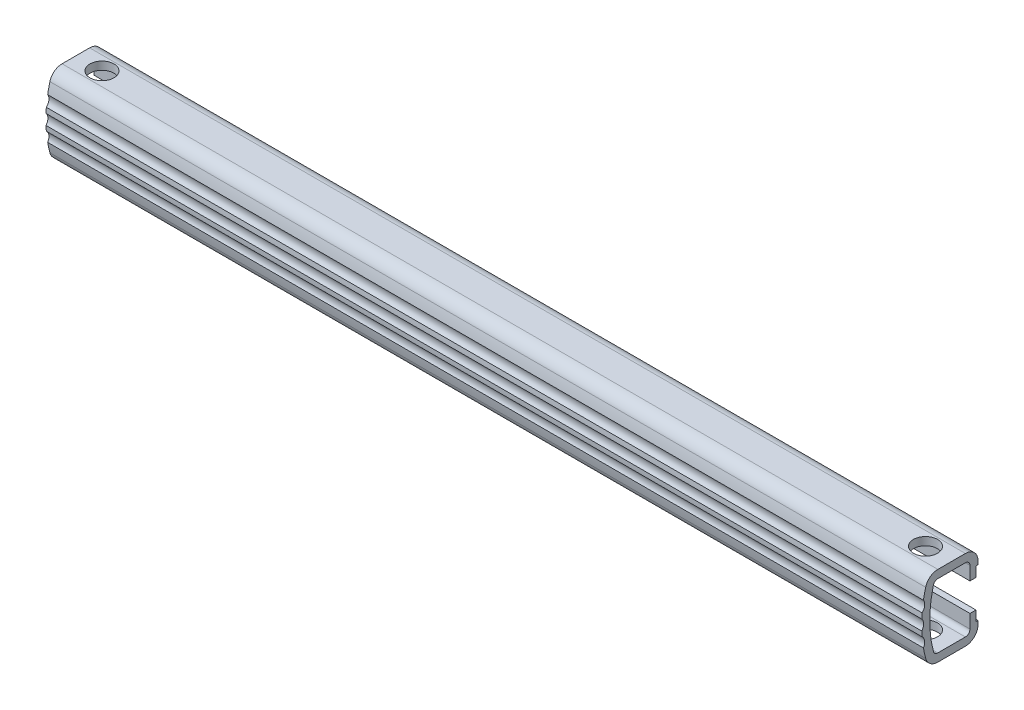
ISO-10303-21;
HEADER;
FILE_DESCRIPTION(('STEP AP214'),'2;1');
FILE_NAME('part.step','',(''),(''),'','','');
FILE_SCHEMA(('AUTOMOTIVE_DESIGN { 1 0 10303 214 1 1 1 1 }'));
ENDSEC;
DATA;
#1=APPLICATION_CONTEXT('core data for automotive mechanical design processes');
#2=APPLICATION_PROTOCOL_DEFINITION('international standard','automotive_design',2000,#1);
#3=PRODUCT_CONTEXT('',#1,'mechanical');
#4=PRODUCT('Part','Part','',(#3));
#5=PRODUCT_RELATED_PRODUCT_CATEGORY('part','',(#4));
#6=PRODUCT_DEFINITION_FORMATION('','',#4);
#7=PRODUCT_DEFINITION_CONTEXT('part definition',#1,'design');
#8=PRODUCT_DEFINITION('design','',#6,#7);
#9=PRODUCT_DEFINITION_SHAPE('','',#8);
#10=(LENGTH_UNIT() NAMED_UNIT(*) SI_UNIT(.MILLI.,.METRE.));
#11=(NAMED_UNIT(*) PLANE_ANGLE_UNIT() SI_UNIT($,.RADIAN.));
#12=(NAMED_UNIT(*) SI_UNIT($,.STERADIAN.) SOLID_ANGLE_UNIT());
#13=UNCERTAINTY_MEASURE_WITH_UNIT(LENGTH_MEASURE(1.E-05),#10,'distance_accuracy_value','');
#14=(GEOMETRIC_REPRESENTATION_CONTEXT(3) GLOBAL_UNCERTAINTY_ASSIGNED_CONTEXT((#13)) GLOBAL_UNIT_ASSIGNED_CONTEXT((#10,
#11,#12)) REPRESENTATION_CONTEXT('',''));
#15=CARTESIAN_POINT('',(0.,0.,0.));
#16=DIRECTION('',(0.,0.,1.));
#17=DIRECTION('',(1.,0.,0.));
#18=AXIS2_PLACEMENT_3D('',#15,#16,#17);
#19=CARTESIAN_POINT('',(54.5,3.43195408950617,-3.28402295524692));
#20=DIRECTION('',(0.,0.,1.));
#21=DIRECTION('',(1.,0.,0.));
#22=AXIS2_PLACEMENT_3D('',#19,#20,#21);
#23=PLANE('',#22);
#24=DIRECTION('',(0.,1.,0.));
#25=VECTOR('',#24,1.);
#26=CARTESIAN_POINT('',(54.5,3.43195408950617,-3.28402295524692));
#27=LINE('',#26,#25);
#28=CARTESIAN_POINT('',(54.5,3.,-3.28402295524692));
#29=VERTEX_POINT('',#28);
#30=CARTESIAN_POINT('',(54.5,3.43195408950617,-3.28402295524692));
#31=VERTEX_POINT('',#30);
#32=EDGE_CURVE('E384',#29,#31,#27,.T.);
#33=ORIENTED_EDGE('',*,*,#32,.F.);
#34=DIRECTION('',(-1.,0.,0.));
#35=VECTOR('',#34,1.);
#36=CARTESIAN_POINT('',(54.5,3.,-3.28402295524692));
#37=LINE('',#36,#35);
#38=CARTESIAN_POINT('',(-54.5,3.,-3.28402295524692));
#39=VERTEX_POINT('',#38);
#40=EDGE_CURVE('E11',#29,#39,#37,.T.);
#41=ORIENTED_EDGE('',*,*,#40,.T.);
#42=DIRECTION('',(0.,1.,0.));
#43=VECTOR('',#42,1.);
#44=CARTESIAN_POINT('',(-54.5,3.43195408950617,-3.28402295524692));
#45=LINE('',#44,#43);
#46=CARTESIAN_POINT('',(-54.5,3.43195408950617,-3.28402295524692));
#47=VERTEX_POINT('',#46);
#48=EDGE_CURVE('E414',#39,#47,#45,.T.);
#49=ORIENTED_EDGE('',*,*,#48,.T.);
#50=DIRECTION('',(-1.,0.,0.));
#51=VECTOR('',#50,1.);
#52=CARTESIAN_POINT('',(54.5,3.43195408950617,-3.28402295524692));
#53=LINE('',#52,#51);
#54=EDGE_CURVE('E431',#31,#47,#53,.T.);
#55=ORIENTED_EDGE('',*,*,#54,.F.);
#56=EDGE_LOOP('',(#33,#41,#49,#55));
#57=FACE_BOUND('',#56,.T.);
#58=ADVANCED_FACE('F31',(#57),#23,.F.);
#59=CARTESIAN_POINT('',(54.5,3.43195408950617,-2.28402295524691));
#60=DIRECTION('',(0.,0.,1.));
#61=DIRECTION('',(0.,-1.,0.));
#62=AXIS2_PLACEMENT_3D('',#59,#60,#61);
#63=PLANE('',#62);
#64=DIRECTION('',(-1.,0.,0.));
#65=VECTOR('',#64,1.);
#66=CARTESIAN_POINT('',(54.5,1.75,-2.28402295524691));
#67=LINE('',#66,#65);
#68=CARTESIAN_POINT('',(54.5,1.75,-2.28402295524691));
#69=VERTEX_POINT('',#68);
#70=CARTESIAN_POINT('',(-54.5,1.75,-2.28402295524692));
#71=VERTEX_POINT('',#70);
#72=EDGE_CURVE('E469',#69,#71,#67,.T.);
#73=ORIENTED_EDGE('',*,*,#72,.F.);
#74=DIRECTION('',(0.,1.,0.));
#75=VECTOR('',#74,1.);
#76=CARTESIAN_POINT('',(54.5,3.43195408950617,-2.28402295524691));
#77=LINE('',#76,#75);
#78=CARTESIAN_POINT('',(54.5,3.43195408950617,-2.28402295524691));
#79=VERTEX_POINT('',#78);
#80=EDGE_CURVE('E311',#69,#79,#77,.T.);
#81=ORIENTED_EDGE('',*,*,#80,.T.);
#82=DIRECTION('',(-1.,0.,0.));
#83=VECTOR('',#82,1.);
#84=CARTESIAN_POINT('',(54.5,3.43195408950617,-2.28402295524691));
#85=LINE('',#84,#83);
#86=CARTESIAN_POINT('',(-54.5,3.43195408950617,-2.28402295524691));
#87=VERTEX_POINT('',#86);
#88=EDGE_CURVE('E347',#79,#87,#85,.T.);
#89=ORIENTED_EDGE('',*,*,#88,.T.);
#90=DIRECTION('',(0.,1.,0.));
#91=VECTOR('',#90,1.);
#92=CARTESIAN_POINT('',(-54.5,3.43195408950617,-2.28402295524691));
#93=LINE('',#92,#91);
#94=EDGE_CURVE('E334',#71,#87,#93,.T.);
#95=ORIENTED_EDGE('',*,*,#94,.F.);
#96=EDGE_LOOP('',(#73,#81,#89,#95));
#97=FACE_BOUND('',#96,.T.);
#98=ADVANCED_FACE('F500',(#97),#63,.T.);
#99=CARTESIAN_POINT('',(54.5,0.,-11.270134066358));
#100=DIRECTION('',(-1.,0.,0.));
#101=DIRECTION('',(0.,0.,1.));
#102=AXIS2_PLACEMENT_3D('',#99,#100,#101);
#103=PLANE('',#102);
#104=ORIENTED_EDGE('',*,*,#80,.F.);
#105=DIRECTION('',(0.,0.,1.));
#106=VECTOR('',#105,1.);
#107=CARTESIAN_POINT('',(54.5,1.75,0.));
#108=LINE('',#107,#106);
#109=CARTESIAN_POINT('',(54.5,1.75,-3.03402295524692));
#110=VERTEX_POINT('',#109);
#111=EDGE_CURVE('E46',#110,#69,#108,.T.);
#112=ORIENTED_EDGE('',*,*,#111,.F.);
#113=DIRECTION('',(0.,-1.,0.));
#114=VECTOR('',#113,1.);
#115=CARTESIAN_POINT('',(54.5,1.75,-3.03402295524692));
#116=LINE('',#115,#114);
#117=CARTESIAN_POINT('',(54.5,3.,-3.03402295524692));
#118=VERTEX_POINT('',#117);
#119=EDGE_CURVE('E257',#118,#110,#116,.T.);
#120=ORIENTED_EDGE('',*,*,#119,.F.);
#121=DIRECTION('',(0.,0.,1.));
#122=VECTOR('',#121,1.);
#123=CARTESIAN_POINT('',(54.5,3.,-3.03402295524692));
#124=LINE('',#123,#122);
#125=EDGE_CURVE('E252',#29,#118,#124,.T.);
#126=ORIENTED_EDGE('',*,*,#125,.F.);
#127=ORIENTED_EDGE('',*,*,#32,.T.);
#128=CARTESIAN_POINT('',(54.5,3.43195408950617,-1.71597704475308));
#129=DIRECTION('',(1.,0.,0.));
#130=DIRECTION('',(0.,0.,1.));
#131=AXIS2_PLACEMENT_3D('',#128,#129,#130);
#132=CIRCLE('',#131,1.56804591049383);
#133=CARTESIAN_POINT('',(54.5,5.,-1.71597704475308));
#134=VERTEX_POINT('',#133);
#135=EDGE_CURVE('E387',#31,#134,#132,.T.);
#136=ORIENTED_EDGE('',*,*,#135,.T.);
#137=DIRECTION('',(0.,0.,1.));
#138=VECTOR('',#137,1.);
#139=CARTESIAN_POINT('',(54.5,5.,1.71597704475308));
#140=LINE('',#139,#138);
#141=CARTESIAN_POINT('',(54.5,5.,1.71597704475308));
#142=VERTEX_POINT('',#141);
#143=EDGE_CURVE('E389',#134,#142,#140,.T.);
#144=ORIENTED_EDGE('',*,*,#143,.T.);
#145=CARTESIAN_POINT('',(54.5,3.43195408950617,1.71597704475308));
#146=DIRECTION('',(1.,0.,0.));
#147=DIRECTION('',(0.,0.,1.));
#148=AXIS2_PLACEMENT_3D('',#145,#146,#147);
#149=CIRCLE('',#148,1.56804591049383);
#150=CARTESIAN_POINT('',(54.5,3.83260030517907,3.23197525955527));
#151=VERTEX_POINT('',#150);
#152=EDGE_CURVE('E391',#142,#151,#149,.T.);
#153=ORIENTED_EDGE('',*,*,#152,.T.);
#154=CARTESIAN_POINT('',(54.5,0.,-11.270134066358));
#155=DIRECTION('',(1.,0.,0.));
#156=DIRECTION('',(0.,0.,1.));
#157=AXIS2_PLACEMENT_3D('',#154,#155,#156);
#158=CIRCLE('',#157,15.);
#159=CARTESIAN_POINT('',(54.5,2.5705835723426,3.50796121339987));
#160=VERTEX_POINT('',#159);
#161=EDGE_CURVE('E362',#151,#160,#158,.T.);
#162=ORIENTED_EDGE('',*,*,#161,.T.);
#163=CARTESIAN_POINT('',(54.5,2.02902279715001,4.34862281402928));
#164=DIRECTION('',(-1.,0.,0.));
#165=DIRECTION('',(0.,0.,-1.));
#166=AXIS2_PLACEMENT_3D('',#163,#164,#165);
#167=CIRCLE('',#166,1.);
#168=CARTESIAN_POINT('',(54.5,1.29064323211042,3.67423745095269));
#169=VERTEX_POINT('',#168);
#170=EDGE_CURVE('E365',#160,#169,#167,.T.);
#171=ORIENTED_EDGE('',*,*,#170,.T.);
#172=CARTESIAN_POINT('',(54.5,0.,-11.270134066358));
#173=DIRECTION('',(1.,0.,0.));
#174=DIRECTION('',(0.,0.,1.));
#175=AXIS2_PLACEMENT_3D('',#172,#173,#174);
#176=CIRCLE('',#175,15.);
#177=CARTESIAN_POINT('',(54.5,0.645347786416052,3.71597704475309));
#178=VERTEX_POINT('',#177);
#179=EDGE_CURVE('E368',#169,#178,#176,.T.);
#180=ORIENTED_EDGE('',*,*,#179,.T.);
#181=CARTESIAN_POINT('',(54.5,0.,4.47986593364197));
#182=DIRECTION('',(-1.,0.,0.));
#183=DIRECTION('',(0.,0.,1.));
#184=AXIS2_PLACEMENT_3D('',#181,#182,#183);
#185=CIRCLE('',#184,1.);
#186=CARTESIAN_POINT('',(54.5,-0.645347786416046,3.71597704475309));
#187=VERTEX_POINT('',#186);
#188=EDGE_CURVE('E370',#178,#187,#185,.T.);
#189=ORIENTED_EDGE('',*,*,#188,.T.);
#190=CARTESIAN_POINT('',(54.5,0.,-11.270134066358));
#191=DIRECTION('',(1.,0.,0.));
#192=DIRECTION('',(0.,0.,-1.));
#193=AXIS2_PLACEMENT_3D('',#190,#191,#192);
#194=CIRCLE('',#193,15.);
#195=CARTESIAN_POINT('',(54.5,-1.29064323211042,3.67423745095269));
#196=VERTEX_POINT('',#195);
#197=EDGE_CURVE('E372',#187,#196,#194,.T.);
#198=ORIENTED_EDGE('',*,*,#197,.T.);
#199=CARTESIAN_POINT('',(54.5,-2.02902279715001,4.34862281402928));
#200=DIRECTION('',(-1.,0.,0.));
#201=DIRECTION('',(0.,0.,1.));
#202=AXIS2_PLACEMENT_3D('',#199,#200,#201);
#203=CIRCLE('',#202,1.);
#204=CARTESIAN_POINT('',(54.5,-2.57058357234259,3.50796121339987));
#205=VERTEX_POINT('',#204);
#206=EDGE_CURVE('E374',#196,#205,#203,.T.);
#207=ORIENTED_EDGE('',*,*,#206,.T.);
#208=CARTESIAN_POINT('',(54.5,0.,-11.270134066358));
#209=DIRECTION('',(1.,0.,0.));
#210=DIRECTION('',(0.,0.,-1.));
#211=AXIS2_PLACEMENT_3D('',#208,#209,#210);
#212=CIRCLE('',#211,15.);
#213=CARTESIAN_POINT('',(54.5,-3.83260030517907,3.23197525955527));
#214=VERTEX_POINT('',#213);
#215=EDGE_CURVE('E376',#205,#214,#212,.T.);
#216=ORIENTED_EDGE('',*,*,#215,.T.);
#217=CARTESIAN_POINT('',(54.5,-3.43195408950617,1.71597704475308));
#218=DIRECTION('',(1.,0.,0.));
#219=DIRECTION('',(0.,0.,-1.));
#220=AXIS2_PLACEMENT_3D('',#217,#218,#219);
#221=CIRCLE('',#220,1.56804591049383);
#222=CARTESIAN_POINT('',(54.5,-5.,1.71597704475308));
#223=VERTEX_POINT('',#222);
#224=EDGE_CURVE('E378',#214,#223,#221,.T.);
#225=ORIENTED_EDGE('',*,*,#224,.T.);
#226=DIRECTION('',(0.,0.,-1.));
#227=VECTOR('',#226,1.);
#228=CARTESIAN_POINT('',(54.5,-5.,1.71597704475308));
#229=LINE('',#228,#227);
#230=CARTESIAN_POINT('',(54.5,-5.,-1.71597704475308));
#231=VERTEX_POINT('',#230);
#232=EDGE_CURVE('E380',#223,#231,#229,.T.);
#233=ORIENTED_EDGE('',*,*,#232,.T.);
#234=CARTESIAN_POINT('',(54.5,-3.43195408950617,-1.71597704475308));
#235=DIRECTION('',(1.,0.,0.));
#236=DIRECTION('',(0.,0.,-1.));
#237=AXIS2_PLACEMENT_3D('',#234,#235,#236);
#238=CIRCLE('',#237,1.56804591049383);
#239=CARTESIAN_POINT('',(54.5,-3.43195408950617,-3.28402295524692));
#240=VERTEX_POINT('',#239);
#241=EDGE_CURVE('E382',#231,#240,#238,.T.);
#242=ORIENTED_EDGE('',*,*,#241,.T.);
#243=CARTESIAN_POINT('',(54.5,-3.,-3.28402295524692));
#244=VERTEX_POINT('',#243);
#245=EDGE_CURVE('E385',#240,#244,#27,.T.);
#246=ORIENTED_EDGE('',*,*,#245,.T.);
#247=DIRECTION('',(0.,0.,-1.));
#248=VECTOR('',#247,1.);
#249=CARTESIAN_POINT('',(54.5,-3.,-3.03402295524692));
#250=LINE('',#249,#248);
#251=CARTESIAN_POINT('',(54.5,-3.,-3.03402295524692));
#252=VERTEX_POINT('',#251);
#253=EDGE_CURVE('E250',#252,#244,#250,.T.);
#254=ORIENTED_EDGE('',*,*,#253,.F.);
#255=DIRECTION('',(0.,-1.,0.));
#256=VECTOR('',#255,1.);
#257=CARTESIAN_POINT('',(54.5,-1.75,-3.03402295524692));
#258=LINE('',#257,#256);
#259=CARTESIAN_POINT('',(54.5,-1.75,-3.03402295524692));
#260=VERTEX_POINT('',#259);
#261=EDGE_CURVE('E236',#260,#252,#258,.T.);
#262=ORIENTED_EDGE('',*,*,#261,.F.);
#263=DIRECTION('',(0.,0.,-1.));
#264=VECTOR('',#263,1.);
#265=CARTESIAN_POINT('',(54.5,-1.75,0.));
#266=LINE('',#265,#264);
#267=CARTESIAN_POINT('',(54.5,-1.75,-2.28402295524692));
#268=VERTEX_POINT('',#267);
#269=EDGE_CURVE('E226',#268,#260,#266,.T.);
#270=ORIENTED_EDGE('',*,*,#269,.F.);
#271=CARTESIAN_POINT('',(54.5,-3.43195408950617,-2.28402295524692));
#272=VERTEX_POINT('',#271);
#273=EDGE_CURVE('E312',#272,#268,#77,.T.);
#274=ORIENTED_EDGE('',*,*,#273,.F.);
#275=CARTESIAN_POINT('',(54.5,-3.43195408950617,-1.71597704475308));
#276=DIRECTION('',(1.,0.,0.));
#277=DIRECTION('',(0.,0.,-1.));
#278=AXIS2_PLACEMENT_3D('',#275,#276,#277);
#279=CIRCLE('',#278,0.568045910493831);
#280=CARTESIAN_POINT('',(54.5,-4.,-1.71597704475309));
#281=VERTEX_POINT('',#280);
#282=EDGE_CURVE('E309',#281,#272,#279,.T.);
#283=ORIENTED_EDGE('',*,*,#282,.F.);
#284=DIRECTION('',(0.,0.,-1.));
#285=VECTOR('',#284,1.);
#286=CARTESIAN_POINT('',(54.5,-4.,1.71597704475309));
#287=LINE('',#286,#285);
#288=CARTESIAN_POINT('',(54.5,-4.,1.71597704475309));
#289=VERTEX_POINT('',#288);
#290=EDGE_CURVE('E307',#289,#281,#287,.T.);
#291=ORIENTED_EDGE('',*,*,#290,.F.);
#292=CARTESIAN_POINT('',(54.5,-3.43195408950617,1.71597704475308));
#293=DIRECTION('',(1.,0.,0.));
#294=DIRECTION('',(0.,0.,-1.));
#295=AXIS2_PLACEMENT_3D('',#292,#293,#294);
#296=CIRCLE('',#295,0.568045910493831);
#297=CARTESIAN_POINT('',(54.5,-3.57709361816713,2.26516797116105));
#298=VERTEX_POINT('',#297);
#299=EDGE_CURVE('E305',#298,#289,#296,.T.);
#300=ORIENTED_EDGE('',*,*,#299,.F.);
#301=CARTESIAN_POINT('',(54.5,0.,-11.270134066358));
#302=DIRECTION('',(1.,0.,0.));
#303=DIRECTION('',(0.,0.,1.));
#304=AXIS2_PLACEMENT_3D('',#301,#302,#303);
#305=CIRCLE('',#304,14.);
#306=CARTESIAN_POINT('',(54.5,3.57709361816713,2.26516797116105));
#307=VERTEX_POINT('',#306);
#308=EDGE_CURVE('E302',#307,#298,#305,.T.);
#309=ORIENTED_EDGE('',*,*,#308,.F.);
#310=CARTESIAN_POINT('',(54.5,3.43195408950617,1.71597704475308));
#311=DIRECTION('',(1.,0.,0.));
#312=DIRECTION('',(0.,0.,1.));
#313=AXIS2_PLACEMENT_3D('',#310,#311,#312);
#314=CIRCLE('',#313,0.568045910493831);
#315=CARTESIAN_POINT('',(54.5,4.,1.71597704475308));
#316=VERTEX_POINT('',#315);
#317=EDGE_CURVE('E300',#316,#307,#314,.T.);
#318=ORIENTED_EDGE('',*,*,#317,.F.);
#319=DIRECTION('',(0.,0.,1.));
#320=VECTOR('',#319,1.);
#321=CARTESIAN_POINT('',(54.5,4.,1.71597704475308));
#322=LINE('',#321,#320);
#323=CARTESIAN_POINT('',(54.5,4.,-1.71597704475309));
#324=VERTEX_POINT('',#323);
#325=EDGE_CURVE('E317',#324,#316,#322,.T.);
#326=ORIENTED_EDGE('',*,*,#325,.F.);
#327=CARTESIAN_POINT('',(54.5,3.43195408950617,-1.71597704475308));
#328=DIRECTION('',(1.,0.,0.));
#329=DIRECTION('',(0.,0.,1.));
#330=AXIS2_PLACEMENT_3D('',#327,#328,#329);
#331=CIRCLE('',#330,0.568045910493831);
#332=EDGE_CURVE('E314',#79,#324,#331,.T.);
#333=ORIENTED_EDGE('',*,*,#332,.F.);
#334=EDGE_LOOP('',(#104,#112,#120,#126,#127,#136,#144,#153,#162,#171,#180,#189,#198,#207,#216,
#225,#233,#242,#246,#254,#262,#270,#274,#283,#291,#300,#309,#318,#326,#333));
#335=FACE_BOUND('',#334,.T.);
#336=ADVANCED_FACE('F248',(#335),#103,.F.);
#337=CARTESIAN_POINT('',(-54.5,0.,-11.270134066358));
#338=DIRECTION('',(-1.,0.,0.));
#339=DIRECTION('',(0.,0.,1.));
#340=AXIS2_PLACEMENT_3D('',#337,#338,#339);
#341=PLANE('',#340);
#342=DIRECTION('',(0.,0.,1.));
#343=VECTOR('',#342,1.);
#344=CARTESIAN_POINT('',(-54.5,1.75,0.));
#345=LINE('',#344,#343);
#346=CARTESIAN_POINT('',(-54.5,1.75,-3.03402295524692));
#347=VERTEX_POINT('',#346);
#348=EDGE_CURVE('E260',#347,#71,#345,.T.);
#349=ORIENTED_EDGE('',*,*,#348,.T.);
#350=ORIENTED_EDGE('',*,*,#94,.T.);
#351=CARTESIAN_POINT('',(-54.5,3.43195408950617,-1.71597704475308));
#352=DIRECTION('',(1.,0.,0.));
#353=DIRECTION('',(0.,0.,1.));
#354=AXIS2_PLACEMENT_3D('',#351,#352,#353);
#355=CIRCLE('',#354,0.568045910493831);
#356=CARTESIAN_POINT('',(-54.5,4.,-1.71597704475308));
#357=VERTEX_POINT('',#356);
#358=EDGE_CURVE('E338',#87,#357,#355,.T.);
#359=ORIENTED_EDGE('',*,*,#358,.T.);
#360=DIRECTION('',(0.,0.,1.));
#361=VECTOR('',#360,1.);
#362=CARTESIAN_POINT('',(-54.5,4.,1.71597704475308));
#363=LINE('',#362,#361);
#364=CARTESIAN_POINT('',(-54.5,4.,1.71597704475309));
#365=VERTEX_POINT('',#364);
#366=EDGE_CURVE('E303',#357,#365,#363,.T.);
#367=ORIENTED_EDGE('',*,*,#366,.T.);
#368=CARTESIAN_POINT('',(-54.5,3.43195408950617,1.71597704475308));
#369=DIRECTION('',(1.,0.,0.));
#370=DIRECTION('',(0.,0.,1.));
#371=AXIS2_PLACEMENT_3D('',#368,#369,#370);
#372=CIRCLE('',#371,0.568045910493831);
#373=CARTESIAN_POINT('',(-54.5,3.57709361816713,2.26516797116105));
#374=VERTEX_POINT('',#373);
#375=EDGE_CURVE('E299',#365,#374,#372,.T.);
#376=ORIENTED_EDGE('',*,*,#375,.T.);
#377=CARTESIAN_POINT('',(-54.5,0.,-11.270134066358));
#378=DIRECTION('',(1.,0.,0.));
#379=DIRECTION('',(0.,0.,1.));
#380=AXIS2_PLACEMENT_3D('',#377,#378,#379);
#381=CIRCLE('',#380,14.);
#382=CARTESIAN_POINT('',(-54.5,-3.57709361816713,2.26516797116105));
#383=VERTEX_POINT('',#382);
#384=EDGE_CURVE('E322',#374,#383,#381,.T.);
#385=ORIENTED_EDGE('',*,*,#384,.T.);
#386=CARTESIAN_POINT('',(-54.5,-3.43195408950617,1.71597704475308));
#387=DIRECTION('',(1.,0.,0.));
#388=DIRECTION('',(0.,0.,-1.));
#389=AXIS2_PLACEMENT_3D('',#386,#387,#388);
#390=CIRCLE('',#389,0.568045910493831);
#391=CARTESIAN_POINT('',(-54.5,-4.,1.71597704475309));
#392=VERTEX_POINT('',#391);
#393=EDGE_CURVE('E325',#383,#392,#390,.T.);
#394=ORIENTED_EDGE('',*,*,#393,.T.);
#395=DIRECTION('',(0.,0.,-1.));
#396=VECTOR('',#395,1.);
#397=CARTESIAN_POINT('',(-54.5,-4.,1.71597704475309));
#398=LINE('',#397,#396);
#399=CARTESIAN_POINT('',(-54.5,-4.,-1.71597704475309));
#400=VERTEX_POINT('',#399);
#401=EDGE_CURVE('E328',#392,#400,#398,.T.);
#402=ORIENTED_EDGE('',*,*,#401,.T.);
#403=CARTESIAN_POINT('',(-54.5,-3.43195408950617,-1.71597704475308));
#404=DIRECTION('',(1.,0.,0.));
#405=DIRECTION('',(0.,0.,-1.));
#406=AXIS2_PLACEMENT_3D('',#403,#404,#405);
#407=CIRCLE('',#406,0.568045910493831);
#408=CARTESIAN_POINT('',(-54.5,-3.43195408950617,-2.28402295524692));
#409=VERTEX_POINT('',#408);
#410=EDGE_CURVE('E331',#400,#409,#407,.T.);
#411=ORIENTED_EDGE('',*,*,#410,.T.);
#412=CARTESIAN_POINT('',(-54.5,-1.75,-2.28402295524692));
#413=VERTEX_POINT('',#412);
#414=EDGE_CURVE('E335',#409,#413,#93,.T.);
#415=ORIENTED_EDGE('',*,*,#414,.T.);
#416=DIRECTION('',(0.,0.,-1.));
#417=VECTOR('',#416,1.);
#418=CARTESIAN_POINT('',(-54.5,-1.75,0.));
#419=LINE('',#418,#417);
#420=CARTESIAN_POINT('',(-54.5,-1.75,-3.03402295524692));
#421=VERTEX_POINT('',#420);
#422=EDGE_CURVE('E54',#413,#421,#419,.T.);
#423=ORIENTED_EDGE('',*,*,#422,.T.);
#424=DIRECTION('',(0.,-1.,0.));
#425=VECTOR('',#424,1.);
#426=CARTESIAN_POINT('',(-54.5,-1.75,-3.03402295524692));
#427=LINE('',#426,#425);
#428=CARTESIAN_POINT('',(-54.5,-3.,-3.03402295524692));
#429=VERTEX_POINT('',#428);
#430=EDGE_CURVE('E243',#421,#429,#427,.T.);
#431=ORIENTED_EDGE('',*,*,#430,.T.);
#432=DIRECTION('',(0.,0.,-1.));
#433=VECTOR('',#432,1.);
#434=CARTESIAN_POINT('',(-54.5,-3.,-3.03402295524692));
#435=LINE('',#434,#433);
#436=CARTESIAN_POINT('',(-54.5,-3.,-3.28402295524692));
#437=VERTEX_POINT('',#436);
#438=EDGE_CURVE('E265',#429,#437,#435,.T.);
#439=ORIENTED_EDGE('',*,*,#438,.T.);
#440=CARTESIAN_POINT('',(-54.5,-3.43195408950617,-3.28402295524692));
#441=VERTEX_POINT('',#440);
#442=EDGE_CURVE('E415',#441,#437,#45,.T.);
#443=ORIENTED_EDGE('',*,*,#442,.F.);
#444=CARTESIAN_POINT('',(-54.5,-3.43195408950617,-1.71597704475308));
#445=DIRECTION('',(1.,0.,0.));
#446=DIRECTION('',(0.,0.,-1.));
#447=AXIS2_PLACEMENT_3D('',#444,#445,#446);
#448=CIRCLE('',#447,1.56804591049383);
#449=CARTESIAN_POINT('',(-54.5,-5.,-1.71597704475308));
#450=VERTEX_POINT('',#449);
#451=EDGE_CURVE('E412',#450,#441,#448,.T.);
#452=ORIENTED_EDGE('',*,*,#451,.F.);
#453=DIRECTION('',(0.,0.,-1.));
#454=VECTOR('',#453,1.);
#455=CARTESIAN_POINT('',(-54.5,-5.,1.71597704475308));
#456=LINE('',#455,#454);
#457=CARTESIAN_POINT('',(-54.5,-5.,1.71597704475308));
#458=VERTEX_POINT('',#457);
#459=EDGE_CURVE('E410',#458,#450,#456,.T.);
#460=ORIENTED_EDGE('',*,*,#459,.F.);
#461=CARTESIAN_POINT('',(-54.5,-3.43195408950617,1.71597704475308));
#462=DIRECTION('',(1.,0.,0.));
#463=DIRECTION('',(0.,0.,-1.));
#464=AXIS2_PLACEMENT_3D('',#461,#462,#463);
#465=CIRCLE('',#464,1.56804591049383);
#466=CARTESIAN_POINT('',(-54.5,-3.83260030517907,3.23197525955527));
#467=VERTEX_POINT('',#466);
#468=EDGE_CURVE('E408',#467,#458,#465,.T.);
#469=ORIENTED_EDGE('',*,*,#468,.F.);
#470=CARTESIAN_POINT('',(-54.5,0.,-11.270134066358));
#471=DIRECTION('',(1.,0.,0.));
#472=DIRECTION('',(0.,0.,-1.));
#473=AXIS2_PLACEMENT_3D('',#470,#471,#472);
#474=CIRCLE('',#473,15.);
#475=CARTESIAN_POINT('',(-54.5,-2.57058357234259,3.50796121339987));
#476=VERTEX_POINT('',#475);
#477=EDGE_CURVE('E406',#476,#467,#474,.T.);
#478=ORIENTED_EDGE('',*,*,#477,.F.);
#479=CARTESIAN_POINT('',(-54.5,-2.02902279715001,4.34862281402928));
#480=DIRECTION('',(-1.,0.,0.));
#481=DIRECTION('',(0.,0.,1.));
#482=AXIS2_PLACEMENT_3D('',#479,#480,#481);
#483=CIRCLE('',#482,1.);
#484=CARTESIAN_POINT('',(-54.5,-1.29064323211042,3.67423745095269));
#485=VERTEX_POINT('',#484);
#486=EDGE_CURVE('E404',#485,#476,#483,.T.);
#487=ORIENTED_EDGE('',*,*,#486,.F.);
#488=CARTESIAN_POINT('',(-54.5,0.,-11.270134066358));
#489=DIRECTION('',(1.,0.,0.));
#490=DIRECTION('',(0.,0.,-1.));
#491=AXIS2_PLACEMENT_3D('',#488,#489,#490);
#492=CIRCLE('',#491,15.);
#493=CARTESIAN_POINT('',(-54.5,-0.645347786416046,3.71597704475309));
#494=VERTEX_POINT('',#493);
#495=EDGE_CURVE('E402',#494,#485,#492,.T.);
#496=ORIENTED_EDGE('',*,*,#495,.F.);
#497=CARTESIAN_POINT('',(-54.5,0.,4.47986593364197));
#498=DIRECTION('',(-1.,0.,0.));
#499=DIRECTION('',(0.,0.,1.));
#500=AXIS2_PLACEMENT_3D('',#497,#498,#499);
#501=CIRCLE('',#500,1.);
#502=CARTESIAN_POINT('',(-54.5,0.645347786416052,3.71597704475309));
#503=VERTEX_POINT('',#502);
#504=EDGE_CURVE('E400',#503,#494,#501,.T.);
#505=ORIENTED_EDGE('',*,*,#504,.F.);
#506=CARTESIAN_POINT('',(-54.5,0.,-11.270134066358));
#507=DIRECTION('',(1.,0.,0.));
#508=DIRECTION('',(0.,0.,1.));
#509=AXIS2_PLACEMENT_3D('',#506,#507,#508);
#510=CIRCLE('',#509,15.);
#511=CARTESIAN_POINT('',(-54.5,1.29064323211042,3.67423745095269));
#512=VERTEX_POINT('',#511);
#513=EDGE_CURVE('E398',#512,#503,#510,.T.);
#514=ORIENTED_EDGE('',*,*,#513,.F.);
#515=CARTESIAN_POINT('',(-54.5,2.02902279715001,4.34862281402928));
#516=DIRECTION('',(-1.,0.,0.));
#517=DIRECTION('',(0.,0.,-1.));
#518=AXIS2_PLACEMENT_3D('',#515,#516,#517);
#519=CIRCLE('',#518,1.);
#520=CARTESIAN_POINT('',(-54.5,2.5705835723426,3.50796121339987));
#521=VERTEX_POINT('',#520);
#522=EDGE_CURVE('E396',#521,#512,#519,.T.);
#523=ORIENTED_EDGE('',*,*,#522,.F.);
#524=CARTESIAN_POINT('',(-54.5,0.,-11.270134066358));
#525=DIRECTION('',(1.,0.,0.));
#526=DIRECTION('',(0.,0.,1.));
#527=AXIS2_PLACEMENT_3D('',#524,#525,#526);
#528=CIRCLE('',#527,15.);
#529=CARTESIAN_POINT('',(-54.5,3.83260030517907,3.23197525955527));
#530=VERTEX_POINT('',#529);
#531=EDGE_CURVE('E361',#530,#521,#528,.T.);
#532=ORIENTED_EDGE('',*,*,#531,.F.);
#533=CARTESIAN_POINT('',(-54.5,3.43195408950617,1.71597704475308));
#534=DIRECTION('',(1.,0.,0.));
#535=DIRECTION('',(0.,0.,1.));
#536=AXIS2_PLACEMENT_3D('',#533,#534,#535);
#537=CIRCLE('',#536,1.56804591049383);
#538=CARTESIAN_POINT('',(-54.5,5.,1.71597704475308));
#539=VERTEX_POINT('',#538);
#540=EDGE_CURVE('E366',#539,#530,#537,.T.);
#541=ORIENTED_EDGE('',*,*,#540,.F.);
#542=DIRECTION('',(0.,0.,1.));
#543=VECTOR('',#542,1.);
#544=CARTESIAN_POINT('',(-54.5,5.,1.71597704475308));
#545=LINE('',#544,#543);
#546=CARTESIAN_POINT('',(-54.5,5.,-1.71597704475308));
#547=VERTEX_POINT('',#546);
#548=EDGE_CURVE('E420',#547,#539,#545,.T.);
#549=ORIENTED_EDGE('',*,*,#548,.F.);
#550=CARTESIAN_POINT('',(-54.5,3.43195408950617,-1.71597704475308));
#551=DIRECTION('',(1.,0.,0.));
#552=DIRECTION('',(0.,0.,1.));
#553=AXIS2_PLACEMENT_3D('',#550,#551,#552);
#554=CIRCLE('',#553,1.56804591049383);
#555=EDGE_CURVE('E418',#47,#547,#554,.T.);
#556=ORIENTED_EDGE('',*,*,#555,.F.);
#557=ORIENTED_EDGE('',*,*,#48,.F.);
#558=DIRECTION('',(0.,0.,1.));
#559=VECTOR('',#558,1.);
#560=CARTESIAN_POINT('',(-54.5,3.,-3.03402295524692));
#561=LINE('',#560,#559);
#562=CARTESIAN_POINT('',(-54.5,3.,-3.03402295524692));
#563=VERTEX_POINT('',#562);
#564=EDGE_CURVE('E268',#39,#563,#561,.T.);
#565=ORIENTED_EDGE('',*,*,#564,.T.);
#566=DIRECTION('',(0.,-1.,0.));
#567=VECTOR('',#566,1.);
#568=CARTESIAN_POINT('',(-54.5,1.75,-3.03402295524692));
#569=LINE('',#568,#567);
#570=EDGE_CURVE('E245',#563,#347,#569,.T.);
#571=ORIENTED_EDGE('',*,*,#570,.T.);
#572=EDGE_LOOP('',(#349,#350,#359,#367,#376,#385,#394,#402,#411,#415,#423,#431,#439,#443,#452,
#460,#469,#478,#487,#496,#505,#514,#523,#532,#541,#549,#556,#557,#565,#571));
#573=FACE_BOUND('',#572,.T.);
#574=ADVANCED_FACE('F485',(#573),#341,.T.);
#575=CARTESIAN_POINT('',(54.5,0.,-11.270134066358));
#576=DIRECTION('',(-1.,0.,0.));
#577=DIRECTION('',(0.,0.,1.));
#578=AXIS2_PLACEMENT_3D('',#575,#576,#577);
#579=CYLINDRICAL_SURFACE('',#578,15.);
#580=ORIENTED_EDGE('',*,*,#531,.T.);
#581=DIRECTION('',(-1.,0.,0.));
#582=VECTOR('',#581,1.);
#583=CARTESIAN_POINT('',(54.5,2.5705835723426,3.50796121339987));
#584=LINE('',#583,#582);
#585=EDGE_CURVE('E461',#160,#521,#584,.T.);
#586=ORIENTED_EDGE('',*,*,#585,.F.);
#587=ORIENTED_EDGE('',*,*,#161,.F.);
#588=DIRECTION('',(-1.,0.,0.));
#589=VECTOR('',#588,1.);
#590=CARTESIAN_POINT('',(54.5,3.83260030517907,3.23197525955527));
#591=LINE('',#590,#589);
#592=EDGE_CURVE('E393',#151,#530,#591,.T.);
#593=ORIENTED_EDGE('',*,*,#592,.T.);
#594=EDGE_LOOP('',(#580,#586,#587,#593));
#595=FACE_BOUND('',#594,.T.);
#596=ADVANCED_FACE('F33',(#595),#579,.T.);
#597=CARTESIAN_POINT('',(54.5,2.02902279715001,4.34862281402928));
#598=DIRECTION('',(-1.,0.,0.));
#599=DIRECTION('',(0.,0.,1.));
#600=AXIS2_PLACEMENT_3D('',#597,#598,#599);
#601=CYLINDRICAL_SURFACE('',#600,1.);
#602=ORIENTED_EDGE('',*,*,#522,.T.);
#603=DIRECTION('',(-1.,0.,0.));
#604=VECTOR('',#603,1.);
#605=CARTESIAN_POINT('',(54.5,1.29064323211042,3.67423745095269));
#606=LINE('',#605,#604);
#607=EDGE_CURVE('E458',#169,#512,#606,.T.);
#608=ORIENTED_EDGE('',*,*,#607,.F.);
#609=ORIENTED_EDGE('',*,*,#170,.F.);
#610=ORIENTED_EDGE('',*,*,#585,.T.);
#611=EDGE_LOOP('',(#602,#608,#609,#610));
#612=FACE_BOUND('',#611,.T.);
#613=ADVANCED_FACE('F549',(#612),#601,.F.);
#614=CARTESIAN_POINT('',(54.5,0.,-11.270134066358));
#615=DIRECTION('',(-1.,0.,0.));
#616=DIRECTION('',(0.,0.,1.));
#617=AXIS2_PLACEMENT_3D('',#614,#615,#616);
#618=CYLINDRICAL_SURFACE('',#617,15.);
#619=ORIENTED_EDGE('',*,*,#513,.T.);
#620=DIRECTION('',(-1.,0.,0.));
#621=VECTOR('',#620,1.);
#622=CARTESIAN_POINT('',(54.5,0.645347786416052,3.71597704475309));
#623=LINE('',#622,#621);
#624=EDGE_CURVE('E455',#178,#503,#623,.T.);
#625=ORIENTED_EDGE('',*,*,#624,.F.);
#626=ORIENTED_EDGE('',*,*,#179,.F.);
#627=ORIENTED_EDGE('',*,*,#607,.T.);
#628=EDGE_LOOP('',(#619,#625,#626,#627));
#629=FACE_BOUND('',#628,.T.);
#630=ADVANCED_FACE('F546',(#629),#618,.T.);
#631=CARTESIAN_POINT('',(54.5,0.,4.47986593364197));
#632=DIRECTION('',(-1.,0.,0.));
#633=DIRECTION('',(0.,0.,1.));
#634=AXIS2_PLACEMENT_3D('',#631,#632,#633);
#635=CYLINDRICAL_SURFACE('',#634,1.);
#636=ORIENTED_EDGE('',*,*,#504,.T.);
#637=DIRECTION('',(-1.,0.,0.));
#638=VECTOR('',#637,1.);
#639=CARTESIAN_POINT('',(54.5,-0.645347786416046,3.71597704475309));
#640=LINE('',#639,#638);
#641=EDGE_CURVE('E452',#187,#494,#640,.T.);
#642=ORIENTED_EDGE('',*,*,#641,.F.);
#643=ORIENTED_EDGE('',*,*,#188,.F.);
#644=ORIENTED_EDGE('',*,*,#624,.T.);
#645=EDGE_LOOP('',(#636,#642,#643,#644));
#646=FACE_BOUND('',#645,.T.);
#647=ADVANCED_FACE('F542',(#646),#635,.F.);
#648=CARTESIAN_POINT('',(54.5,0.,-11.270134066358));
#649=DIRECTION('',(-1.,0.,0.));
#650=DIRECTION('',(0.,0.,1.));
#651=AXIS2_PLACEMENT_3D('',#648,#649,#650);
#652=CYLINDRICAL_SURFACE('',#651,15.);
#653=ORIENTED_EDGE('',*,*,#495,.T.);
#654=DIRECTION('',(-1.,0.,0.));
#655=VECTOR('',#654,1.);
#656=CARTESIAN_POINT('',(54.5,-1.29064323211042,3.67423745095269));
#657=LINE('',#656,#655);
#658=EDGE_CURVE('E449',#196,#485,#657,.T.);
#659=ORIENTED_EDGE('',*,*,#658,.F.);
#660=ORIENTED_EDGE('',*,*,#197,.F.);
#661=ORIENTED_EDGE('',*,*,#641,.T.);
#662=EDGE_LOOP('',(#653,#659,#660,#661));
#663=FACE_BOUND('',#662,.T.);
#664=ADVANCED_FACE('F538',(#663),#652,.T.);
#665=CARTESIAN_POINT('',(54.5,-2.02902279715001,4.34862281402928));
#666=DIRECTION('',(-1.,0.,0.));
#667=DIRECTION('',(0.,0.,1.));
#668=AXIS2_PLACEMENT_3D('',#665,#666,#667);
#669=CYLINDRICAL_SURFACE('',#668,1.);
#670=ORIENTED_EDGE('',*,*,#486,.T.);
#671=DIRECTION('',(-1.,0.,0.));
#672=VECTOR('',#671,1.);
#673=CARTESIAN_POINT('',(54.5,-2.57058357234259,3.50796121339987));
#674=LINE('',#673,#672);
#675=EDGE_CURVE('E446',#205,#476,#674,.T.);
#676=ORIENTED_EDGE('',*,*,#675,.F.);
#677=ORIENTED_EDGE('',*,*,#206,.F.);
#678=ORIENTED_EDGE('',*,*,#658,.T.);
#679=EDGE_LOOP('',(#670,#676,#677,#678));
#680=FACE_BOUND('',#679,.T.);
#681=ADVANCED_FACE('F534',(#680),#669,.F.);
#682=CARTESIAN_POINT('',(54.5,0.,-11.270134066358));
#683=DIRECTION('',(-1.,0.,0.));
#684=DIRECTION('',(0.,0.,1.));
#685=AXIS2_PLACEMENT_3D('',#682,#683,#684);
#686=CYLINDRICAL_SURFACE('',#685,15.);
#687=ORIENTED_EDGE('',*,*,#477,.T.);
#688=DIRECTION('',(-1.,0.,0.));
#689=VECTOR('',#688,1.);
#690=CARTESIAN_POINT('',(54.5,-3.83260030517907,3.23197525955527));
#691=LINE('',#690,#689);
#692=EDGE_CURVE('E443',#214,#467,#691,.T.);
#693=ORIENTED_EDGE('',*,*,#692,.F.);
#694=ORIENTED_EDGE('',*,*,#215,.F.);
#695=ORIENTED_EDGE('',*,*,#675,.T.);
#696=EDGE_LOOP('',(#687,#693,#694,#695));
#697=FACE_BOUND('',#696,.T.);
#698=ADVANCED_FACE('F530',(#697),#686,.T.);
#699=CARTESIAN_POINT('',(54.5,-3.43195408950617,1.71597704475308));
#700=DIRECTION('',(-1.,0.,0.));
#701=DIRECTION('',(0.,0.,1.));
#702=AXIS2_PLACEMENT_3D('',#699,#700,#701);
#703=CYLINDRICAL_SURFACE('',#702,1.56804591049383);
#704=ORIENTED_EDGE('',*,*,#468,.T.);
#705=DIRECTION('',(-1.,0.,0.));
#706=VECTOR('',#705,1.);
#707=CARTESIAN_POINT('',(54.5,-5.,1.71597704475308));
#708=LINE('',#707,#706);
#709=EDGE_CURVE('E440',#223,#458,#708,.T.);
#710=ORIENTED_EDGE('',*,*,#709,.F.);
#711=ORIENTED_EDGE('',*,*,#224,.F.);
#712=ORIENTED_EDGE('',*,*,#692,.T.);
#713=EDGE_LOOP('',(#704,#710,#711,#712));
#714=FACE_BOUND('',#713,.T.);
#715=ADVANCED_FACE('F524',(#714),#703,.T.);
#716=CARTESIAN_POINT('',(54.5,-5.,1.71597704475308));
#717=DIRECTION('',(0.,1.,0.));
#718=DIRECTION('',(0.,0.,1.));
#719=AXIS2_PLACEMENT_3D('',#716,#717,#718);
#720=PLANE('',#719);
#721=CARTESIAN_POINT('',(51.25,-5.,0.));
#722=DIRECTION('',(0.,1.,0.));
#723=DIRECTION('',(0.,0.,-1.));
#724=AXIS2_PLACEMENT_3D('',#721,#722,#723);
#725=CIRCLE('',#724,1.5);
#726=CARTESIAN_POINT('',(51.25,-5.,-1.50000000000002));
#727=VERTEX_POINT('',#726);
#728=EDGE_CURVE('E282',#727,#727,#725,.T.);
#729=ORIENTED_EDGE('',*,*,#728,.T.);
#730=EDGE_LOOP('',(#729));
#731=FACE_BOUND('',#730,.T.);
#732=CARTESIAN_POINT('',(-51.25,-5.,0.));
#733=DIRECTION('',(0.,1.,0.));
#734=DIRECTION('',(0.,0.,1.));
#735=AXIS2_PLACEMENT_3D('',#732,#733,#734);
#736=CIRCLE('',#735,1.5);
#737=CARTESIAN_POINT('',(-51.25,-5.,1.5));
#738=VERTEX_POINT('',#737);
#739=EDGE_CURVE('E292',#738,#738,#736,.T.);
#740=ORIENTED_EDGE('',*,*,#739,.T.);
#741=EDGE_LOOP('',(#740));
#742=FACE_BOUND('',#741,.T.);
#743=ORIENTED_EDGE('',*,*,#459,.T.);
#744=DIRECTION('',(-1.,0.,0.));
#745=VECTOR('',#744,1.);
#746=CARTESIAN_POINT('',(54.5,-5.,-1.71597704475308));
#747=LINE('',#746,#745);
#748=EDGE_CURVE('E437',#231,#450,#747,.T.);
#749=ORIENTED_EDGE('',*,*,#748,.F.);
#750=ORIENTED_EDGE('',*,*,#232,.F.);
#751=ORIENTED_EDGE('',*,*,#709,.T.);
#752=EDGE_LOOP('',(#743,#749,#750,#751));
#753=FACE_BOUND('',#752,.T.);
#754=ADVANCED_FACE('F520',(#731,#742,#753),#720,.F.);
#755=CARTESIAN_POINT('',(54.5,-3.43195408950617,-1.71597704475308));
#756=DIRECTION('',(-1.,0.,0.));
#757=DIRECTION('',(0.,0.,1.));
#758=AXIS2_PLACEMENT_3D('',#755,#756,#757);
#759=CYLINDRICAL_SURFACE('',#758,1.56804591049383);
#760=ORIENTED_EDGE('',*,*,#451,.T.);
#761=DIRECTION('',(-1.,0.,0.));
#762=VECTOR('',#761,1.);
#763=CARTESIAN_POINT('',(54.5,-3.43195408950617,-3.28402295524692));
#764=LINE('',#763,#762);
#765=EDGE_CURVE('E434',#240,#441,#764,.T.);
#766=ORIENTED_EDGE('',*,*,#765,.F.);
#767=ORIENTED_EDGE('',*,*,#241,.F.);
#768=ORIENTED_EDGE('',*,*,#748,.T.);
#769=EDGE_LOOP('',(#760,#766,#767,#768));
#770=FACE_BOUND('',#769,.T.);
#771=ADVANCED_FACE('F482',(#770),#759,.T.);
#772=ORIENTED_EDGE('',*,*,#442,.T.);
#773=DIRECTION('',(1.,0.,0.));
#774=VECTOR('',#773,1.);
#775=CARTESIAN_POINT('',(54.5,-3.,-3.28402295524692));
#776=LINE('',#775,#774);
#777=EDGE_CURVE('E39',#437,#244,#776,.T.);
#778=ORIENTED_EDGE('',*,*,#777,.T.);
#779=ORIENTED_EDGE('',*,*,#245,.F.);
#780=ORIENTED_EDGE('',*,*,#765,.T.);
#781=EDGE_LOOP('',(#772,#778,#779,#780));
#782=FACE_BOUND('',#781,.T.);
#783=ADVANCED_FACE('F473',(#782),#23,.F.);
#784=CARTESIAN_POINT('',(54.5,3.43195408950617,-1.71597704475308));
#785=DIRECTION('',(-1.,0.,0.));
#786=DIRECTION('',(0.,0.,1.));
#787=AXIS2_PLACEMENT_3D('',#784,#785,#786);
#788=CYLINDRICAL_SURFACE('',#787,1.56804591049383);
#789=ORIENTED_EDGE('',*,*,#555,.T.);
#790=DIRECTION('',(-1.,0.,0.));
#791=VECTOR('',#790,1.);
#792=CARTESIAN_POINT('',(54.5,5.,-1.71597704475308));
#793=LINE('',#792,#791);
#794=EDGE_CURVE('E428',#134,#547,#793,.T.);
#795=ORIENTED_EDGE('',*,*,#794,.F.);
#796=ORIENTED_EDGE('',*,*,#135,.F.);
#797=ORIENTED_EDGE('',*,*,#54,.T.);
#798=EDGE_LOOP('',(#789,#795,#796,#797));
#799=FACE_BOUND('',#798,.T.);
#800=ADVANCED_FACE('F513',(#799),#788,.T.);
#801=CARTESIAN_POINT('',(54.5,5.,1.71597704475308));
#802=DIRECTION('',(0.,-1.,0.));
#803=DIRECTION('',(0.,0.,-1.));
#804=AXIS2_PLACEMENT_3D('',#801,#802,#803);
#805=PLANE('',#804);
#806=CARTESIAN_POINT('',(51.25,5.,0.));
#807=DIRECTION('',(0.,1.,0.));
#808=DIRECTION('',(0.,0.,-1.));
#809=AXIS2_PLACEMENT_3D('',#806,#807,#808);
#810=CIRCLE('',#809,1.5);
#811=CARTESIAN_POINT('',(51.25,5.,-1.50000000000002));
#812=VERTEX_POINT('',#811);
#813=EDGE_CURVE('E275',#812,#812,#810,.T.);
#814=ORIENTED_EDGE('',*,*,#813,.F.);
#815=EDGE_LOOP('',(#814));
#816=FACE_BOUND('',#815,.T.);
#817=CARTESIAN_POINT('',(-51.25,5.,0.));
#818=DIRECTION('',(0.,1.,0.));
#819=DIRECTION('',(0.,0.,1.));
#820=AXIS2_PLACEMENT_3D('',#817,#818,#819);
#821=CIRCLE('',#820,1.5);
#822=CARTESIAN_POINT('',(-51.25,5.,1.5));
#823=VERTEX_POINT('',#822);
#824=EDGE_CURVE('E289',#823,#823,#821,.T.);
#825=ORIENTED_EDGE('',*,*,#824,.F.);
#826=EDGE_LOOP('',(#825));
#827=FACE_BOUND('',#826,.T.);
#828=ORIENTED_EDGE('',*,*,#548,.T.);
#829=DIRECTION('',(-1.,0.,0.));
#830=VECTOR('',#829,1.);
#831=CARTESIAN_POINT('',(54.5,5.,1.71597704475308));
#832=LINE('',#831,#830);
#833=EDGE_CURVE('E425',#142,#539,#832,.T.);
#834=ORIENTED_EDGE('',*,*,#833,.F.);
#835=ORIENTED_EDGE('',*,*,#143,.F.);
#836=ORIENTED_EDGE('',*,*,#794,.T.);
#837=EDGE_LOOP('',(#828,#834,#835,#836));
#838=FACE_BOUND('',#837,.T.);
#839=ADVANCED_FACE('F518',(#816,#827,#838),#805,.F.);
#840=CARTESIAN_POINT('',(54.5,3.43195408950617,1.71597704475308));
#841=DIRECTION('',(-1.,0.,0.));
#842=DIRECTION('',(0.,0.,1.));
#843=AXIS2_PLACEMENT_3D('',#840,#841,#842);
#844=CYLINDRICAL_SURFACE('',#843,1.56804591049383);
#845=ORIENTED_EDGE('',*,*,#540,.T.);
#846=ORIENTED_EDGE('',*,*,#592,.F.);
#847=ORIENTED_EDGE('',*,*,#152,.F.);
#848=ORIENTED_EDGE('',*,*,#833,.T.);
#849=EDGE_LOOP('',(#845,#846,#847,#848));
#850=FACE_BOUND('',#849,.T.);
#851=ADVANCED_FACE('F579',(#850),#844,.T.);
#852=CARTESIAN_POINT('',(54.5,3.43195408950617,1.71597704475308));
#853=DIRECTION('',(-1.,0.,0.));
#854=DIRECTION('',(0.,0.,1.));
#855=AXIS2_PLACEMENT_3D('',#852,#853,#854);
#856=CYLINDRICAL_SURFACE('',#855,0.568045910493831);
#857=ORIENTED_EDGE('',*,*,#375,.F.);
#858=DIRECTION('',(-1.,0.,0.));
#859=VECTOR('',#858,1.);
#860=CARTESIAN_POINT('',(54.5,4.,1.71597704475308));
#861=LINE('',#860,#859);
#862=EDGE_CURVE('E319',#316,#365,#861,.T.);
#863=ORIENTED_EDGE('',*,*,#862,.F.);
#864=ORIENTED_EDGE('',*,*,#317,.T.);
#865=DIRECTION('',(-1.,0.,0.));
#866=VECTOR('',#865,1.);
#867=CARTESIAN_POINT('',(54.5,3.57709361816713,2.26516797116105));
#868=LINE('',#867,#866);
#869=EDGE_CURVE('E358',#307,#374,#868,.T.);
#870=ORIENTED_EDGE('',*,*,#869,.T.);
#871=EDGE_LOOP('',(#857,#863,#864,#870));
#872=FACE_BOUND('',#871,.T.);
#873=ADVANCED_FACE('F607',(#872),#856,.F.);
#874=CARTESIAN_POINT('',(54.5,0.,-11.270134066358));
#875=DIRECTION('',(-1.,0.,0.));
#876=DIRECTION('',(0.,0.,1.));
#877=AXIS2_PLACEMENT_3D('',#874,#875,#876);
#878=CYLINDRICAL_SURFACE('',#877,14.);
#879=ORIENTED_EDGE('',*,*,#384,.F.);
#880=ORIENTED_EDGE('',*,*,#869,.F.);
#881=ORIENTED_EDGE('',*,*,#308,.T.);
#882=DIRECTION('',(-1.,0.,0.));
#883=VECTOR('',#882,1.);
#884=CARTESIAN_POINT('',(54.5,-3.57709361816713,2.26516797116105));
#885=LINE('',#884,#883);
#886=EDGE_CURVE('E356',#298,#383,#885,.T.);
#887=ORIENTED_EDGE('',*,*,#886,.T.);
#888=EDGE_LOOP('',(#879,#880,#881,#887));
#889=FACE_BOUND('',#888,.T.);
#890=ADVANCED_FACE('F614',(#889),#878,.F.);
#891=CARTESIAN_POINT('',(54.5,-3.43195408950617,1.71597704475308));
#892=DIRECTION('',(-1.,0.,0.));
#893=DIRECTION('',(0.,0.,1.));
#894=AXIS2_PLACEMENT_3D('',#891,#892,#893);
#895=CYLINDRICAL_SURFACE('',#894,0.568045910493831);
#896=ORIENTED_EDGE('',*,*,#393,.F.);
#897=ORIENTED_EDGE('',*,*,#886,.F.);
#898=ORIENTED_EDGE('',*,*,#299,.T.);
#899=DIRECTION('',(-1.,0.,0.));
#900=VECTOR('',#899,1.);
#901=CARTESIAN_POINT('',(54.5,-4.,1.71597704475309));
#902=LINE('',#901,#900);
#903=EDGE_CURVE('E354',#289,#392,#902,.T.);
#904=ORIENTED_EDGE('',*,*,#903,.T.);
#905=EDGE_LOOP('',(#896,#897,#898,#904));
#906=FACE_BOUND('',#905,.T.);
#907=ADVANCED_FACE('F617',(#906),#895,.F.);
#908=CARTESIAN_POINT('',(54.5,-4.,1.71597704475309));
#909=DIRECTION('',(0.,1.,0.));
#910=DIRECTION('',(0.,0.,1.));
#911=AXIS2_PLACEMENT_3D('',#908,#909,#910);
#912=PLANE('',#911);
#913=CARTESIAN_POINT('',(51.25,-4.,0.));
#914=DIRECTION('',(0.,1.,0.));
#915=DIRECTION('',(0.,0.,1.));
#916=AXIS2_PLACEMENT_3D('',#913,#914,#915);
#917=CIRCLE('',#916,1.5);
#918=CARTESIAN_POINT('',(51.25,-4.,1.49999999999999));
#919=VERTEX_POINT('',#918);
#920=EDGE_CURVE('E286',#919,#919,#917,.T.);
#921=ORIENTED_EDGE('',*,*,#920,.F.);
#922=EDGE_LOOP('',(#921));
#923=FACE_BOUND('',#922,.T.);
#924=CARTESIAN_POINT('',(-51.25,-4.,0.));
#925=DIRECTION('',(0.,1.,0.));
#926=DIRECTION('',(0.,0.,1.));
#927=AXIS2_PLACEMENT_3D('',#924,#925,#926);
#928=CIRCLE('',#927,1.5);
#929=CARTESIAN_POINT('',(-51.25,-4.,1.5));
#930=VERTEX_POINT('',#929);
#931=EDGE_CURVE('E296',#930,#930,#928,.T.);
#932=ORIENTED_EDGE('',*,*,#931,.F.);
#933=EDGE_LOOP('',(#932));
#934=FACE_BOUND('',#933,.T.);
#935=ORIENTED_EDGE('',*,*,#401,.F.);
#936=ORIENTED_EDGE('',*,*,#903,.F.);
#937=ORIENTED_EDGE('',*,*,#290,.T.);
#938=DIRECTION('',(-1.,0.,0.));
#939=VECTOR('',#938,1.);
#940=CARTESIAN_POINT('',(54.5,-4.,-1.71597704475309));
#941=LINE('',#940,#939);
#942=EDGE_CURVE('E352',#281,#400,#941,.T.);
#943=ORIENTED_EDGE('',*,*,#942,.T.);
#944=EDGE_LOOP('',(#935,#936,#937,#943));
#945=FACE_BOUND('',#944,.T.);
#946=ADVANCED_FACE('F622',(#923,#934,#945),#912,.T.);
#947=CARTESIAN_POINT('',(54.5,-3.43195408950617,-1.71597704475308));
#948=DIRECTION('',(-1.,0.,0.));
#949=DIRECTION('',(0.,0.,1.));
#950=AXIS2_PLACEMENT_3D('',#947,#948,#949);
#951=CYLINDRICAL_SURFACE('',#950,0.568045910493831);
#952=ORIENTED_EDGE('',*,*,#410,.F.);
#953=ORIENTED_EDGE('',*,*,#942,.F.);
#954=ORIENTED_EDGE('',*,*,#282,.T.);
#955=DIRECTION('',(-1.,0.,0.));
#956=VECTOR('',#955,1.);
#957=CARTESIAN_POINT('',(54.5,-3.43195408950617,-2.28402295524692));
#958=LINE('',#957,#956);
#959=EDGE_CURVE('E350',#272,#409,#958,.T.);
#960=ORIENTED_EDGE('',*,*,#959,.T.);
#961=EDGE_LOOP('',(#952,#953,#954,#960));
#962=FACE_BOUND('',#961,.T.);
#963=ADVANCED_FACE('F626',(#962),#951,.F.);
#964=DIRECTION('',(1.,0.,0.));
#965=VECTOR('',#964,1.);
#966=CARTESIAN_POINT('',(54.5,-1.75,-2.28402295524692));
#967=LINE('',#966,#965);
#968=EDGE_CURVE('E231',#413,#268,#967,.T.);
#969=ORIENTED_EDGE('',*,*,#968,.F.);
#970=ORIENTED_EDGE('',*,*,#414,.F.);
#971=ORIENTED_EDGE('',*,*,#959,.F.);
#972=ORIENTED_EDGE('',*,*,#273,.T.);
#973=EDGE_LOOP('',(#969,#970,#971,#972));
#974=FACE_BOUND('',#973,.T.);
#975=ADVANCED_FACE('F508',(#974),#63,.T.);
#976=CARTESIAN_POINT('',(54.5,3.43195408950617,-1.71597704475308));
#977=DIRECTION('',(-1.,0.,0.));
#978=DIRECTION('',(0.,0.,1.));
#979=AXIS2_PLACEMENT_3D('',#976,#977,#978);
#980=CYLINDRICAL_SURFACE('',#979,0.568045910493831);
#981=ORIENTED_EDGE('',*,*,#358,.F.);
#982=ORIENTED_EDGE('',*,*,#88,.F.);
#983=ORIENTED_EDGE('',*,*,#332,.T.);
#984=DIRECTION('',(-1.,0.,0.));
#985=VECTOR('',#984,1.);
#986=CARTESIAN_POINT('',(54.5,4.,-1.71597704475308));
#987=LINE('',#986,#985);
#988=EDGE_CURVE('E345',#324,#357,#987,.T.);
#989=ORIENTED_EDGE('',*,*,#988,.T.);
#990=EDGE_LOOP('',(#981,#982,#983,#989));
#991=FACE_BOUND('',#990,.T.);
#992=ADVANCED_FACE('F599',(#991),#980,.F.);
#993=CARTESIAN_POINT('',(54.5,4.,1.71597704475308));
#994=DIRECTION('',(0.,-1.,0.));
#995=DIRECTION('',(0.,0.,-1.));
#996=AXIS2_PLACEMENT_3D('',#993,#994,#995);
#997=PLANE('',#996);
#998=CARTESIAN_POINT('',(51.25,4.,0.));
#999=DIRECTION('',(0.,-1.,0.));
#1000=DIRECTION('',(0.,0.,-1.));
#1001=AXIS2_PLACEMENT_3D('',#998,#999,#1000);
#1002=CIRCLE('',#1001,1.5);
#1003=CARTESIAN_POINT('',(51.25,4.,-1.50000000000002));
#1004=VERTEX_POINT('',#1003);
#1005=EDGE_CURVE('E285',#1004,#1004,#1002,.T.);
#1006=ORIENTED_EDGE('',*,*,#1005,.F.);
#1007=EDGE_LOOP('',(#1006));
#1008=FACE_BOUND('',#1007,.T.);
#1009=CARTESIAN_POINT('',(-51.25,4.,0.));
#1010=DIRECTION('',(0.,-1.,0.));
#1011=DIRECTION('',(0.,0.,-1.));
#1012=AXIS2_PLACEMENT_3D('',#1009,#1010,#1011);
#1013=CIRCLE('',#1012,1.5);
#1014=CARTESIAN_POINT('',(-51.25,4.,-1.5));
#1015=VERTEX_POINT('',#1014);
#1016=EDGE_CURVE('E295',#1015,#1015,#1013,.T.);
#1017=ORIENTED_EDGE('',*,*,#1016,.F.);
#1018=EDGE_LOOP('',(#1017));
#1019=FACE_BOUND('',#1018,.T.);
#1020=ORIENTED_EDGE('',*,*,#366,.F.);
#1021=ORIENTED_EDGE('',*,*,#988,.F.);
#1022=ORIENTED_EDGE('',*,*,#325,.T.);
#1023=ORIENTED_EDGE('',*,*,#862,.T.);
#1024=EDGE_LOOP('',(#1020,#1021,#1022,#1023));
#1025=FACE_BOUND('',#1024,.T.);
#1026=ADVANCED_FACE('F602',(#1008,#1019,#1025),#997,.T.);
#1027=CARTESIAN_POINT('',(-51.25,-5.,0.));
#1028=DIRECTION('',(0.,1.,0.));
#1029=DIRECTION('',(0.,0.,1.));
#1030=AXIS2_PLACEMENT_3D('',#1027,#1028,#1029);
#1031=CYLINDRICAL_SURFACE('',#1030,1.5);
#1032=ORIENTED_EDGE('',*,*,#1016,.T.);
#1033=EDGE_LOOP('',(#1032));
#1034=FACE_BOUND('',#1033,.T.);
#1035=ORIENTED_EDGE('',*,*,#824,.T.);
#1036=EDGE_LOOP('',(#1035));
#1037=FACE_BOUND('',#1036,.T.);
#1038=ADVANCED_FACE('F662',(#1034,#1037),#1031,.F.);
#1039=ORIENTED_EDGE('',*,*,#931,.T.);
#1040=EDGE_LOOP('',(#1039));
#1041=FACE_BOUND('',#1040,.T.);
#1042=ORIENTED_EDGE('',*,*,#739,.F.);
#1043=EDGE_LOOP('',(#1042));
#1044=FACE_BOUND('',#1043,.T.);
#1045=ADVANCED_FACE('F664',(#1041,#1044),#1031,.F.);
#1046=CARTESIAN_POINT('',(51.25,-5.,0.));
#1047=DIRECTION('',(0.,1.,0.));
#1048=DIRECTION('',(0.,0.,1.));
#1049=AXIS2_PLACEMENT_3D('',#1046,#1047,#1048);
#1050=CYLINDRICAL_SURFACE('',#1049,1.5);
#1051=ORIENTED_EDGE('',*,*,#1005,.T.);
#1052=EDGE_LOOP('',(#1051));
#1053=FACE_BOUND('',#1052,.T.);
#1054=ORIENTED_EDGE('',*,*,#813,.T.);
#1055=EDGE_LOOP('',(#1054));
#1056=FACE_BOUND('',#1055,.T.);
#1057=ADVANCED_FACE('F671',(#1053,#1056),#1050,.F.);
#1058=ORIENTED_EDGE('',*,*,#920,.T.);
#1059=EDGE_LOOP('',(#1058));
#1060=FACE_BOUND('',#1059,.T.);
#1061=ORIENTED_EDGE('',*,*,#728,.F.);
#1062=EDGE_LOOP('',(#1061));
#1063=FACE_BOUND('',#1062,.T.);
#1064=ADVANCED_FACE('F496',(#1060,#1063),#1050,.F.);
#1065=CARTESIAN_POINT('',(-54.5,-1.75,0.));
#1066=DIRECTION('',(0.,-1.,0.));
#1067=DIRECTION('',(0.,0.,-1.));
#1068=AXIS2_PLACEMENT_3D('',#1065,#1066,#1067);
#1069=PLANE('',#1068);
#1070=ORIENTED_EDGE('',*,*,#968,.T.);
#1071=ORIENTED_EDGE('',*,*,#269,.T.);
#1072=DIRECTION('',(1.,0.,0.));
#1073=VECTOR('',#1072,1.);
#1074=CARTESIAN_POINT('',(-54.5,-1.75,-3.03402295524692));
#1075=LINE('',#1074,#1073);
#1076=EDGE_CURVE('E229',#421,#260,#1075,.T.);
#1077=ORIENTED_EDGE('',*,*,#1076,.F.);
#1078=ORIENTED_EDGE('',*,*,#422,.F.);
#1079=EDGE_LOOP('',(#1070,#1071,#1077,#1078));
#1080=FACE_BOUND('',#1079,.T.);
#1081=ADVANCED_FACE('F228',(#1080),#1069,.F.);
#1082=CARTESIAN_POINT('',(-54.5,-3.,-3.03402295524692));
#1083=DIRECTION('',(0.,-1.,0.));
#1084=DIRECTION('',(0.,0.,-1.));
#1085=AXIS2_PLACEMENT_3D('',#1082,#1083,#1084);
#1086=PLANE('',#1085);
#1087=ORIENTED_EDGE('',*,*,#438,.F.);
#1088=DIRECTION('',(1.,0.,0.));
#1089=VECTOR('',#1088,1.);
#1090=CARTESIAN_POINT('',(-54.5,-3.,-3.03402295524692));
#1091=LINE('',#1090,#1089);
#1092=EDGE_CURVE('E244',#429,#252,#1091,.T.);
#1093=ORIENTED_EDGE('',*,*,#1092,.T.);
#1094=ORIENTED_EDGE('',*,*,#253,.T.);
#1095=ORIENTED_EDGE('',*,*,#777,.F.);
#1096=EDGE_LOOP('',(#1087,#1093,#1094,#1095));
#1097=FACE_BOUND('',#1096,.T.);
#1098=ADVANCED_FACE('F487',(#1097),#1086,.F.);
#1099=CARTESIAN_POINT('',(-54.5,-1.75,-3.03402295524692));
#1100=DIRECTION('',(0.,0.,1.));
#1101=DIRECTION('',(1.,0.,0.));
#1102=AXIS2_PLACEMENT_3D('',#1099,#1100,#1101);
#1103=PLANE('',#1102);
#1104=ORIENTED_EDGE('',*,*,#1092,.F.);
#1105=ORIENTED_EDGE('',*,*,#430,.F.);
#1106=ORIENTED_EDGE('',*,*,#1076,.T.);
#1107=ORIENTED_EDGE('',*,*,#261,.T.);
#1108=EDGE_LOOP('',(#1104,#1105,#1106,#1107));
#1109=FACE_BOUND('',#1108,.T.);
#1110=ADVANCED_FACE('F240',(#1109),#1103,.F.);
#1111=CARTESIAN_POINT('',(-54.5,3.,-3.03402295524692));
#1112=DIRECTION('',(0.,1.,0.));
#1113=DIRECTION('',(0.,0.,1.));
#1114=AXIS2_PLACEMENT_3D('',#1111,#1112,#1113);
#1115=PLANE('',#1114);
#1116=ORIENTED_EDGE('',*,*,#125,.T.);
#1117=DIRECTION('',(1.,0.,0.));
#1118=VECTOR('',#1117,1.);
#1119=CARTESIAN_POINT('',(-54.5,3.,-3.03402295524692));
#1120=LINE('',#1119,#1118);
#1121=EDGE_CURVE('E276',#563,#118,#1120,.T.);
#1122=ORIENTED_EDGE('',*,*,#1121,.F.);
#1123=ORIENTED_EDGE('',*,*,#564,.F.);
#1124=ORIENTED_EDGE('',*,*,#40,.F.);
#1125=EDGE_LOOP('',(#1116,#1122,#1123,#1124));
#1126=FACE_BOUND('',#1125,.T.);
#1127=ADVANCED_FACE('F494',(#1126),#1115,.F.);
#1128=CARTESIAN_POINT('',(-54.5,1.75,0.));
#1129=DIRECTION('',(0.,1.,0.));
#1130=DIRECTION('',(0.,0.,1.));
#1131=AXIS2_PLACEMENT_3D('',#1128,#1129,#1130);
#1132=PLANE('',#1131);
#1133=ORIENTED_EDGE('',*,*,#72,.T.);
#1134=ORIENTED_EDGE('',*,*,#348,.F.);
#1135=DIRECTION('',(1.,0.,0.));
#1136=VECTOR('',#1135,1.);
#1137=CARTESIAN_POINT('',(-54.5,1.75,-3.03402295524692));
#1138=LINE('',#1137,#1136);
#1139=EDGE_CURVE('E273',#347,#110,#1138,.T.);
#1140=ORIENTED_EDGE('',*,*,#1139,.T.);
#1141=ORIENTED_EDGE('',*,*,#111,.T.);
#1142=EDGE_LOOP('',(#1133,#1134,#1140,#1141));
#1143=FACE_BOUND('',#1142,.T.);
#1144=ADVANCED_FACE('F678',(#1143),#1132,.F.);
#1145=CARTESIAN_POINT('',(-54.5,1.75,-3.03402295524692));
#1146=DIRECTION('',(0.,0.,1.));
#1147=DIRECTION('',(1.,0.,0.));
#1148=AXIS2_PLACEMENT_3D('',#1145,#1146,#1147);
#1149=PLANE('',#1148);
#1150=ORIENTED_EDGE('',*,*,#1139,.F.);
#1151=ORIENTED_EDGE('',*,*,#570,.F.);
#1152=ORIENTED_EDGE('',*,*,#1121,.T.);
#1153=ORIENTED_EDGE('',*,*,#119,.T.);
#1154=EDGE_LOOP('',(#1150,#1151,#1152,#1153));
#1155=FACE_BOUND('',#1154,.T.);
#1156=ADVANCED_FACE('F591',(#1155),#1149,.F.);
#1157=CLOSED_SHELL('',(#58,#98,#336,#574,#596,#613,#630,#647,#664,#681,#698,#715,#754,#771,#783,
#800,#839,#851,#873,#890,#907,#946,#963,#975,#992,#1026,#1038,#1045,#1057,#1064,#1081,#1098,
#1110,#1127,#1144,#1156));
#1158=MANIFOLD_SOLID_BREP('B2',#1157);
#1159=ADVANCED_BREP_SHAPE_REPRESENTATION('',(#18,#1158),#14);
#1160=SHAPE_DEFINITION_REPRESENTATION(#9,#1159);
ENDSEC;
END-ISO-10303-21;
